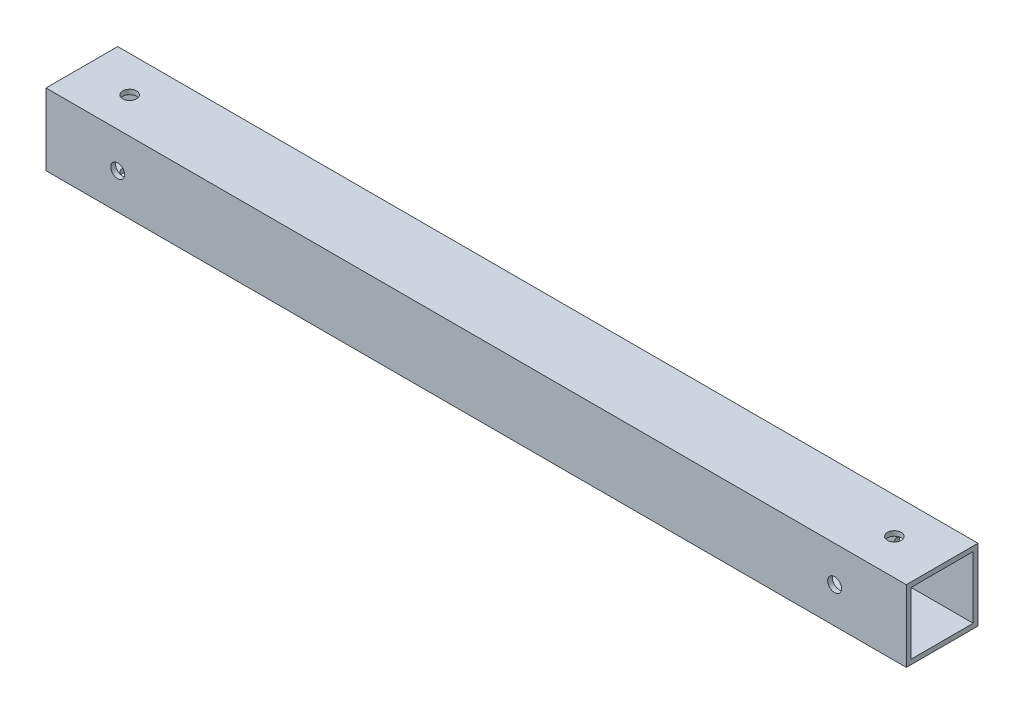
ISO-10303-21;
HEADER;
FILE_DESCRIPTION(('STEP AP214'),'2;1');
FILE_NAME('part.step','',(''),(''),'','','');
FILE_SCHEMA(('AUTOMOTIVE_DESIGN { 1 0 10303 214 1 1 1 1 }'));
ENDSEC;
DATA;
#1=APPLICATION_CONTEXT('core data for automotive mechanical design processes');
#2=APPLICATION_PROTOCOL_DEFINITION('international standard','automotive_design',2000,#1);
#3=PRODUCT_CONTEXT('',#1,'mechanical');
#4=PRODUCT('Part','Part','',(#3));
#5=PRODUCT_RELATED_PRODUCT_CATEGORY('part','',(#4));
#6=PRODUCT_DEFINITION_FORMATION('','',#4);
#7=PRODUCT_DEFINITION_CONTEXT('part definition',#1,'design');
#8=PRODUCT_DEFINITION('design','',#6,#7);
#9=PRODUCT_DEFINITION_SHAPE('','',#8);
#10=(LENGTH_UNIT() NAMED_UNIT(*) SI_UNIT(.MILLI.,.METRE.));
#11=(NAMED_UNIT(*) PLANE_ANGLE_UNIT() SI_UNIT($,.RADIAN.));
#12=(NAMED_UNIT(*) SI_UNIT($,.STERADIAN.) SOLID_ANGLE_UNIT());
#13=UNCERTAINTY_MEASURE_WITH_UNIT(LENGTH_MEASURE(1.E-05),#10,'distance_accuracy_value','');
#14=(GEOMETRIC_REPRESENTATION_CONTEXT(3) GLOBAL_UNCERTAINTY_ASSIGNED_CONTEXT((#13)) GLOBAL_UNIT_ASSIGNED_CONTEXT((#10,
#11,#12)) REPRESENTATION_CONTEXT('',''));
#15=CARTESIAN_POINT('',(0.,0.,0.));
#16=DIRECTION('',(0.,0.,1.));
#17=DIRECTION('',(1.,0.,0.));
#18=AXIS2_PLACEMENT_3D('',#15,#16,#17);
#19=CARTESIAN_POINT('',(180.,0.,0.));
#20=DIRECTION('',(-1.,0.,0.));
#21=DIRECTION('',(0.,0.,1.));
#22=AXIS2_PLACEMENT_3D('',#19,#20,#21);
#23=PLANE('',#22);
#24=DIRECTION('',(0.,1.,0.));
#25=VECTOR('',#24,1.);
#26=CARTESIAN_POINT('',(180.,-7.5,-7.5));
#27=LINE('',#26,#25);
#28=CARTESIAN_POINT('',(180.,-7.5,-7.5));
#29=VERTEX_POINT('',#28);
#30=CARTESIAN_POINT('',(180.,7.5,-7.5));
#31=VERTEX_POINT('',#30);
#32=EDGE_CURVE('E146',#29,#31,#27,.T.);
#33=ORIENTED_EDGE('',*,*,#32,.T.);
#34=DIRECTION('',(0.,0.,1.));
#35=VECTOR('',#34,1.);
#36=CARTESIAN_POINT('',(180.,7.5,7.5));
#37=LINE('',#36,#35);
#38=CARTESIAN_POINT('',(180.,7.5,7.5));
#39=VERTEX_POINT('',#38);
#40=EDGE_CURVE('E149',#31,#39,#37,.T.);
#41=ORIENTED_EDGE('',*,*,#40,.T.);
#42=DIRECTION('',(0.,-1.,0.));
#43=VECTOR('',#42,1.);
#44=CARTESIAN_POINT('',(180.,-7.5,7.5));
#45=LINE('',#44,#43);
#46=CARTESIAN_POINT('',(180.,-7.5,7.5));
#47=VERTEX_POINT('',#46);
#48=EDGE_CURVE('E152',#39,#47,#45,.T.);
#49=ORIENTED_EDGE('',*,*,#48,.T.);
#50=DIRECTION('',(0.,0.,-1.));
#51=VECTOR('',#50,1.);
#52=CARTESIAN_POINT('',(180.,-7.5,7.5));
#53=LINE('',#52,#51);
#54=EDGE_CURVE('E154',#47,#29,#53,.T.);
#55=ORIENTED_EDGE('',*,*,#54,.T.);
#56=EDGE_LOOP('',(#33,#41,#49,#55));
#57=FACE_BOUND('',#56,.T.);
#58=DIRECTION('',(0.,0.,-1.));
#59=VECTOR('',#58,1.);
#60=CARTESIAN_POINT('',(180.,-6.5,6.5));
#61=LINE('',#60,#59);
#62=CARTESIAN_POINT('',(180.,-6.5,6.5));
#63=VERTEX_POINT('',#62);
#64=CARTESIAN_POINT('',(180.,-6.5,-6.5));
#65=VERTEX_POINT('',#64);
#66=EDGE_CURVE('E108',#63,#65,#61,.T.);
#67=ORIENTED_EDGE('',*,*,#66,.F.);
#68=DIRECTION('',(0.,-1.,0.));
#69=VECTOR('',#68,1.);
#70=CARTESIAN_POINT('',(180.,-6.5,6.5));
#71=LINE('',#70,#69);
#72=CARTESIAN_POINT('',(180.,6.5,6.5));
#73=VERTEX_POINT('',#72);
#74=EDGE_CURVE('E130',#73,#63,#71,.T.);
#75=ORIENTED_EDGE('',*,*,#74,.F.);
#76=DIRECTION('',(0.,0.,1.));
#77=VECTOR('',#76,1.);
#78=CARTESIAN_POINT('',(180.,6.5,6.5));
#79=LINE('',#78,#77);
#80=CARTESIAN_POINT('',(180.,6.5,-6.5));
#81=VERTEX_POINT('',#80);
#82=EDGE_CURVE('E128',#81,#73,#79,.T.);
#83=ORIENTED_EDGE('',*,*,#82,.F.);
#84=DIRECTION('',(0.,1.,0.));
#85=VECTOR('',#84,1.);
#86=CARTESIAN_POINT('',(180.,-6.5,-6.5));
#87=LINE('',#86,#85);
#88=EDGE_CURVE('E116',#65,#81,#87,.T.);
#89=ORIENTED_EDGE('',*,*,#88,.F.);
#90=EDGE_LOOP('',(#67,#75,#83,#89));
#91=FACE_BOUND('',#90,.T.);
#92=ADVANCED_FACE('F41',(#57,#91),#23,.F.);
#93=CARTESIAN_POINT('',(0.,0.,0.));
#94=DIRECTION('',(-1.,0.,0.));
#95=DIRECTION('',(0.,0.,1.));
#96=AXIS2_PLACEMENT_3D('',#93,#94,#95);
#97=PLANE('',#96);
#98=DIRECTION('',(0.,1.,0.));
#99=VECTOR('',#98,1.);
#100=CARTESIAN_POINT('',(0.,-7.5,-7.5));
#101=LINE('',#100,#99);
#102=CARTESIAN_POINT('',(0.,-7.5,-7.5));
#103=VERTEX_POINT('',#102);
#104=CARTESIAN_POINT('',(0.,7.5,-7.5));
#105=VERTEX_POINT('',#104);
#106=EDGE_CURVE('E124',#103,#105,#101,.T.);
#107=ORIENTED_EDGE('',*,*,#106,.F.);
#108=DIRECTION('',(0.,0.,-1.));
#109=VECTOR('',#108,1.);
#110=CARTESIAN_POINT('',(0.,-7.5,7.5));
#111=LINE('',#110,#109);
#112=CARTESIAN_POINT('',(0.,-7.5,7.5));
#113=VERTEX_POINT('',#112);
#114=EDGE_CURVE('E150',#113,#103,#111,.T.);
#115=ORIENTED_EDGE('',*,*,#114,.F.);
#116=DIRECTION('',(0.,-1.,0.));
#117=VECTOR('',#116,1.);
#118=CARTESIAN_POINT('',(0.,-7.5,7.5));
#119=LINE('',#118,#117);
#120=CARTESIAN_POINT('',(0.,7.5,7.5));
#121=VERTEX_POINT('',#120);
#122=EDGE_CURVE('E161',#121,#113,#119,.T.);
#123=ORIENTED_EDGE('',*,*,#122,.F.);
#124=DIRECTION('',(0.,0.,1.));
#125=VECTOR('',#124,1.);
#126=CARTESIAN_POINT('',(0.,7.5,7.5));
#127=LINE('',#126,#125);
#128=EDGE_CURVE('E159',#105,#121,#127,.T.);
#129=ORIENTED_EDGE('',*,*,#128,.F.);
#130=EDGE_LOOP('',(#107,#115,#123,#129));
#131=FACE_BOUND('',#130,.T.);
#132=DIRECTION('',(0.,-1.,0.));
#133=VECTOR('',#132,1.);
#134=CARTESIAN_POINT('',(0.,-6.5,6.5));
#135=LINE('',#134,#133);
#136=CARTESIAN_POINT('',(0.,6.5,6.5));
#137=VERTEX_POINT('',#136);
#138=CARTESIAN_POINT('',(0.,-6.5,6.5));
#139=VERTEX_POINT('',#138);
#140=EDGE_CURVE('E117',#137,#139,#135,.T.);
#141=ORIENTED_EDGE('',*,*,#140,.T.);
#142=DIRECTION('',(0.,0.,-1.));
#143=VECTOR('',#142,1.);
#144=CARTESIAN_POINT('',(0.,-6.5,6.5));
#145=LINE('',#144,#143);
#146=CARTESIAN_POINT('',(0.,-6.5,-6.5));
#147=VERTEX_POINT('',#146);
#148=EDGE_CURVE('E66',#139,#147,#145,.T.);
#149=ORIENTED_EDGE('',*,*,#148,.T.);
#150=DIRECTION('',(0.,1.,0.));
#151=VECTOR('',#150,1.);
#152=CARTESIAN_POINT('',(0.,-6.5,-6.5));
#153=LINE('',#152,#151);
#154=CARTESIAN_POINT('',(0.,6.5,-6.5));
#155=VERTEX_POINT('',#154);
#156=EDGE_CURVE('E123',#147,#155,#153,.T.);
#157=ORIENTED_EDGE('',*,*,#156,.T.);
#158=DIRECTION('',(0.,0.,1.));
#159=VECTOR('',#158,1.);
#160=CARTESIAN_POINT('',(0.,6.5,6.5));
#161=LINE('',#160,#159);
#162=EDGE_CURVE('E138',#155,#137,#161,.T.);
#163=ORIENTED_EDGE('',*,*,#162,.T.);
#164=EDGE_LOOP('',(#141,#149,#157,#163));
#165=FACE_BOUND('',#164,.T.);
#166=ADVANCED_FACE('F250',(#131,#165),#97,.T.);
#167=CARTESIAN_POINT('',(180.,-7.5,-7.5));
#168=DIRECTION('',(0.,0.,1.));
#169=DIRECTION('',(1.,0.,0.));
#170=AXIS2_PLACEMENT_3D('',#167,#168,#169);
#171=PLANE('',#170);
#172=CARTESIAN_POINT('',(15.,0.,-7.5));
#173=DIRECTION('',(0.,0.,1.));
#174=DIRECTION('',(1.,0.,0.));
#175=AXIS2_PLACEMENT_3D('',#172,#173,#174);
#176=CIRCLE('',#175,1.45);
#177=CARTESIAN_POINT('',(16.45,0.,-7.5));
#178=VERTEX_POINT('',#177);
#179=EDGE_CURVE('E181',#178,#178,#176,.T.);
#180=ORIENTED_EDGE('',*,*,#179,.T.);
#181=EDGE_LOOP('',(#180));
#182=FACE_BOUND('',#181,.T.);
#183=CARTESIAN_POINT('',(165.,0.,-7.5));
#184=DIRECTION('',(0.,0.,1.));
#185=DIRECTION('',(1.,0.,0.));
#186=AXIS2_PLACEMENT_3D('',#183,#184,#185);
#187=CIRCLE('',#186,1.45);
#188=CARTESIAN_POINT('',(166.45,0.,-7.5));
#189=VERTEX_POINT('',#188);
#190=EDGE_CURVE('E197',#189,#189,#187,.T.);
#191=ORIENTED_EDGE('',*,*,#190,.T.);
#192=EDGE_LOOP('',(#191));
#193=FACE_BOUND('',#192,.T.);
#194=ORIENTED_EDGE('',*,*,#106,.T.);
#195=DIRECTION('',(-1.,0.,0.));
#196=VECTOR('',#195,1.);
#197=CARTESIAN_POINT('',(180.,7.5,-7.5));
#198=LINE('',#197,#196);
#199=EDGE_CURVE('E11',#31,#105,#198,.T.);
#200=ORIENTED_EDGE('',*,*,#199,.F.);
#201=ORIENTED_EDGE('',*,*,#32,.F.);
#202=DIRECTION('',(-1.,0.,0.));
#203=VECTOR('',#202,1.);
#204=CARTESIAN_POINT('',(180.,-7.5,-7.5));
#205=LINE('',#204,#203);
#206=EDGE_CURVE('E156',#29,#103,#205,.T.);
#207=ORIENTED_EDGE('',*,*,#206,.T.);
#208=EDGE_LOOP('',(#194,#200,#201,#207));
#209=FACE_BOUND('',#208,.T.);
#210=ADVANCED_FACE('F43',(#182,#193,#209),#171,.F.);
#211=CARTESIAN_POINT('',(180.,7.5,7.5));
#212=DIRECTION('',(0.,-1.,0.));
#213=DIRECTION('',(0.,0.,-1.));
#214=AXIS2_PLACEMENT_3D('',#211,#212,#213);
#215=PLANE('',#214);
#216=CARTESIAN_POINT('',(9.99999999999999,7.5,0.));
#217=DIRECTION('',(0.,1.,0.));
#218=DIRECTION('',(0.,0.,1.));
#219=AXIS2_PLACEMENT_3D('',#216,#217,#218);
#220=CIRCLE('',#219,1.45);
#221=CARTESIAN_POINT('',(9.99999999999999,7.5,1.45000000000001));
#222=VERTEX_POINT('',#221);
#223=EDGE_CURVE('E206',#222,#222,#220,.T.);
#224=ORIENTED_EDGE('',*,*,#223,.F.);
#225=EDGE_LOOP('',(#224));
#226=FACE_BOUND('',#225,.T.);
#227=CARTESIAN_POINT('',(170.,7.5,0.));
#228=DIRECTION('',(0.,1.,0.));
#229=DIRECTION('',(0.,0.,1.));
#230=AXIS2_PLACEMENT_3D('',#227,#228,#229);
#231=CIRCLE('',#230,1.45);
#232=CARTESIAN_POINT('',(170.,7.5,1.45000000000009));
#233=VERTEX_POINT('',#232);
#234=EDGE_CURVE('E209',#233,#233,#231,.T.);
#235=ORIENTED_EDGE('',*,*,#234,.F.);
#236=EDGE_LOOP('',(#235));
#237=FACE_BOUND('',#236,.T.);
#238=ORIENTED_EDGE('',*,*,#128,.T.);
#239=DIRECTION('',(-1.,0.,0.));
#240=VECTOR('',#239,1.);
#241=CARTESIAN_POINT('',(180.,7.5,7.5));
#242=LINE('',#241,#240);
#243=EDGE_CURVE('E50',#39,#121,#242,.T.);
#244=ORIENTED_EDGE('',*,*,#243,.F.);
#245=ORIENTED_EDGE('',*,*,#40,.F.);
#246=ORIENTED_EDGE('',*,*,#199,.T.);
#247=EDGE_LOOP('',(#238,#244,#245,#246));
#248=FACE_BOUND('',#247,.T.);
#249=ADVANCED_FACE('F254',(#226,#237,#248),#215,.F.);
#250=CARTESIAN_POINT('',(180.,-7.5,7.5));
#251=DIRECTION('',(0.,0.,-1.));
#252=DIRECTION('',(-1.,0.,0.));
#253=AXIS2_PLACEMENT_3D('',#250,#251,#252);
#254=PLANE('',#253);
#255=CARTESIAN_POINT('',(15.,0.,7.5));
#256=DIRECTION('',(0.,0.,1.));
#257=DIRECTION('',(1.,0.,0.));
#258=AXIS2_PLACEMENT_3D('',#255,#256,#257);
#259=CIRCLE('',#258,1.45);
#260=CARTESIAN_POINT('',(16.45,0.,7.5));
#261=VERTEX_POINT('',#260);
#262=EDGE_CURVE('E187',#261,#261,#259,.T.);
#263=ORIENTED_EDGE('',*,*,#262,.F.);
#264=EDGE_LOOP('',(#263));
#265=FACE_BOUND('',#264,.T.);
#266=CARTESIAN_POINT('',(165.,0.,7.5));
#267=DIRECTION('',(0.,0.,1.));
#268=DIRECTION('',(1.,0.,0.));
#269=AXIS2_PLACEMENT_3D('',#266,#267,#268);
#270=CIRCLE('',#269,1.45);
#271=CARTESIAN_POINT('',(166.45,0.,7.5));
#272=VERTEX_POINT('',#271);
#273=EDGE_CURVE('E192',#272,#272,#270,.T.);
#274=ORIENTED_EDGE('',*,*,#273,.F.);
#275=EDGE_LOOP('',(#274));
#276=FACE_BOUND('',#275,.T.);
#277=ORIENTED_EDGE('',*,*,#122,.T.);
#278=DIRECTION('',(-1.,0.,0.));
#279=VECTOR('',#278,1.);
#280=CARTESIAN_POINT('',(180.,-7.5,7.5));
#281=LINE('',#280,#279);
#282=EDGE_CURVE('E166',#47,#113,#281,.T.);
#283=ORIENTED_EDGE('',*,*,#282,.F.);
#284=ORIENTED_EDGE('',*,*,#48,.F.);
#285=ORIENTED_EDGE('',*,*,#243,.T.);
#286=EDGE_LOOP('',(#277,#283,#284,#285));
#287=FACE_BOUND('',#286,.T.);
#288=ADVANCED_FACE('F237',(#265,#276,#287),#254,.F.);
#289=CARTESIAN_POINT('',(180.,-7.5,7.5));
#290=DIRECTION('',(0.,1.,0.));
#291=DIRECTION('',(0.,0.,1.));
#292=AXIS2_PLACEMENT_3D('',#289,#290,#291);
#293=PLANE('',#292);
#294=CARTESIAN_POINT('',(9.99999999999999,-7.5,0.));
#295=DIRECTION('',(0.,1.,0.));
#296=DIRECTION('',(0.,0.,1.));
#297=AXIS2_PLACEMENT_3D('',#294,#295,#296);
#298=CIRCLE('',#297,1.45);
#299=CARTESIAN_POINT('',(9.99999999999999,-7.5,1.45000000000001));
#300=VERTEX_POINT('',#299);
#301=EDGE_CURVE('E175',#300,#300,#298,.T.);
#302=ORIENTED_EDGE('',*,*,#301,.T.);
#303=EDGE_LOOP('',(#302));
#304=FACE_BOUND('',#303,.T.);
#305=CARTESIAN_POINT('',(170.,-7.5,0.));
#306=DIRECTION('',(0.,1.,0.));
#307=DIRECTION('',(0.,0.,1.));
#308=AXIS2_PLACEMENT_3D('',#305,#306,#307);
#309=CIRCLE('',#308,1.45);
#310=CARTESIAN_POINT('',(170.,-7.5,1.45000000000009));
#311=VERTEX_POINT('',#310);
#312=EDGE_CURVE('E203',#311,#311,#309,.T.);
#313=ORIENTED_EDGE('',*,*,#312,.T.);
#314=EDGE_LOOP('',(#313));
#315=FACE_BOUND('',#314,.T.);
#316=ORIENTED_EDGE('',*,*,#114,.T.);
#317=ORIENTED_EDGE('',*,*,#206,.F.);
#318=ORIENTED_EDGE('',*,*,#54,.F.);
#319=ORIENTED_EDGE('',*,*,#282,.T.);
#320=EDGE_LOOP('',(#316,#317,#318,#319));
#321=FACE_BOUND('',#320,.T.);
#322=ADVANCED_FACE('F223',(#304,#315,#321),#293,.F.);
#323=CARTESIAN_POINT('',(180.,-6.5,6.5));
#324=DIRECTION('',(0.,1.,0.));
#325=DIRECTION('',(0.,0.,1.));
#326=AXIS2_PLACEMENT_3D('',#323,#324,#325);
#327=PLANE('',#326);
#328=CARTESIAN_POINT('',(9.99999999999999,-6.5,0.));
#329=DIRECTION('',(0.,1.,0.));
#330=DIRECTION('',(0.,0.,1.));
#331=AXIS2_PLACEMENT_3D('',#328,#329,#330);
#332=CIRCLE('',#331,1.45);
#333=CARTESIAN_POINT('',(9.99999999999999,-6.5,1.45000000000001));
#334=VERTEX_POINT('',#333);
#335=EDGE_CURVE('E136',#334,#334,#332,.T.);
#336=ORIENTED_EDGE('',*,*,#335,.F.);
#337=EDGE_LOOP('',(#336));
#338=FACE_BOUND('',#337,.T.);
#339=CARTESIAN_POINT('',(170.,-6.5,0.));
#340=DIRECTION('',(0.,1.,0.));
#341=DIRECTION('',(0.,0.,1.));
#342=AXIS2_PLACEMENT_3D('',#339,#340,#341);
#343=CIRCLE('',#342,1.45);
#344=CARTESIAN_POINT('',(170.,-6.5,1.45000000000009));
#345=VERTEX_POINT('',#344);
#346=EDGE_CURVE('E174',#345,#345,#343,.T.);
#347=ORIENTED_EDGE('',*,*,#346,.F.);
#348=EDGE_LOOP('',(#347));
#349=FACE_BOUND('',#348,.T.);
#350=ORIENTED_EDGE('',*,*,#148,.F.);
#351=DIRECTION('',(-1.,0.,0.));
#352=VECTOR('',#351,1.);
#353=CARTESIAN_POINT('',(180.,-6.5,6.5));
#354=LINE('',#353,#352);
#355=EDGE_CURVE('E112',#63,#139,#354,.T.);
#356=ORIENTED_EDGE('',*,*,#355,.F.);
#357=ORIENTED_EDGE('',*,*,#66,.T.);
#358=DIRECTION('',(-1.,0.,0.));
#359=VECTOR('',#358,1.);
#360=CARTESIAN_POINT('',(180.,-6.5,-6.5));
#361=LINE('',#360,#359);
#362=EDGE_CURVE('E111',#65,#147,#361,.T.);
#363=ORIENTED_EDGE('',*,*,#362,.T.);
#364=EDGE_LOOP('',(#350,#356,#357,#363));
#365=FACE_BOUND('',#364,.T.);
#366=ADVANCED_FACE('F110',(#338,#349,#365),#327,.T.);
#367=CARTESIAN_POINT('',(180.,-6.5,-6.5));
#368=DIRECTION('',(0.,0.,1.));
#369=DIRECTION('',(0.,-1.,0.));
#370=AXIS2_PLACEMENT_3D('',#367,#368,#369);
#371=PLANE('',#370);
#372=CARTESIAN_POINT('',(15.,0.,-6.5));
#373=DIRECTION('',(0.,0.,1.));
#374=DIRECTION('',(0.,-1.,0.));
#375=AXIS2_PLACEMENT_3D('',#372,#373,#374);
#376=CIRCLE('',#375,1.45);
#377=CARTESIAN_POINT('',(15.,-1.45000000000001,-6.5));
#378=VERTEX_POINT('',#377);
#379=EDGE_CURVE('E200',#378,#378,#376,.T.);
#380=ORIENTED_EDGE('',*,*,#379,.F.);
#381=EDGE_LOOP('',(#380));
#382=FACE_BOUND('',#381,.T.);
#383=CARTESIAN_POINT('',(165.,0.,-6.5));
#384=DIRECTION('',(0.,0.,1.));
#385=DIRECTION('',(0.,-1.,0.));
#386=AXIS2_PLACEMENT_3D('',#383,#384,#385);
#387=CIRCLE('',#386,1.45);
#388=CARTESIAN_POINT('',(165.,-1.45000000000001,-6.5));
#389=VERTEX_POINT('',#388);
#390=EDGE_CURVE('E180',#389,#389,#387,.T.);
#391=ORIENTED_EDGE('',*,*,#390,.F.);
#392=EDGE_LOOP('',(#391));
#393=FACE_BOUND('',#392,.T.);
#394=ORIENTED_EDGE('',*,*,#156,.F.);
#395=ORIENTED_EDGE('',*,*,#362,.F.);
#396=ORIENTED_EDGE('',*,*,#88,.T.);
#397=DIRECTION('',(-1.,0.,0.));
#398=VECTOR('',#397,1.);
#399=CARTESIAN_POINT('',(180.,6.5,-6.5));
#400=LINE('',#399,#398);
#401=EDGE_CURVE('E125',#81,#155,#400,.T.);
#402=ORIENTED_EDGE('',*,*,#401,.T.);
#403=EDGE_LOOP('',(#394,#395,#396,#402));
#404=FACE_BOUND('',#403,.T.);
#405=ADVANCED_FACE('F120',(#382,#393,#404),#371,.T.);
#406=CARTESIAN_POINT('',(180.,6.5,6.5));
#407=DIRECTION('',(0.,-1.,0.));
#408=DIRECTION('',(0.,0.,-1.));
#409=AXIS2_PLACEMENT_3D('',#406,#407,#408);
#410=PLANE('',#409);
#411=CARTESIAN_POINT('',(9.99999999999999,6.5,0.));
#412=DIRECTION('',(0.,-1.,0.));
#413=DIRECTION('',(0.,0.,-1.));
#414=AXIS2_PLACEMENT_3D('',#411,#412,#413);
#415=CIRCLE('',#414,1.45);
#416=CARTESIAN_POINT('',(9.99999999999999,6.5,-1.44999999999999));
#417=VERTEX_POINT('',#416);
#418=EDGE_CURVE('E176',#417,#417,#415,.T.);
#419=ORIENTED_EDGE('',*,*,#418,.F.);
#420=EDGE_LOOP('',(#419));
#421=FACE_BOUND('',#420,.T.);
#422=CARTESIAN_POINT('',(170.,6.5,0.));
#423=DIRECTION('',(0.,-1.,0.));
#424=DIRECTION('',(0.,0.,-1.));
#425=AXIS2_PLACEMENT_3D('',#422,#423,#424);
#426=CIRCLE('',#425,1.45);
#427=CARTESIAN_POINT('',(170.,6.5,-1.44999999999992));
#428=VERTEX_POINT('',#427);
#429=EDGE_CURVE('E171',#428,#428,#426,.T.);
#430=ORIENTED_EDGE('',*,*,#429,.F.);
#431=EDGE_LOOP('',(#430));
#432=FACE_BOUND('',#431,.T.);
#433=ORIENTED_EDGE('',*,*,#162,.F.);
#434=ORIENTED_EDGE('',*,*,#401,.F.);
#435=ORIENTED_EDGE('',*,*,#82,.T.);
#436=DIRECTION('',(-1.,0.,0.));
#437=VECTOR('',#436,1.);
#438=CARTESIAN_POINT('',(180.,6.5,6.5));
#439=LINE('',#438,#437);
#440=EDGE_CURVE('E58',#73,#137,#439,.T.);
#441=ORIENTED_EDGE('',*,*,#440,.T.);
#442=EDGE_LOOP('',(#433,#434,#435,#441));
#443=FACE_BOUND('',#442,.T.);
#444=ADVANCED_FACE('F277',(#421,#432,#443),#410,.T.);
#445=CARTESIAN_POINT('',(180.,-6.5,6.5));
#446=DIRECTION('',(0.,0.,-1.));
#447=DIRECTION('',(-1.,0.,0.));
#448=AXIS2_PLACEMENT_3D('',#445,#446,#447);
#449=PLANE('',#448);
#450=CARTESIAN_POINT('',(15.,0.,6.5));
#451=DIRECTION('',(0.,0.,-1.));
#452=DIRECTION('',(-1.,0.,0.));
#453=AXIS2_PLACEMENT_3D('',#450,#451,#452);
#454=CIRCLE('',#453,1.45);
#455=CARTESIAN_POINT('',(13.55,0.,6.5));
#456=VERTEX_POINT('',#455);
#457=EDGE_CURVE('E45',#456,#456,#454,.T.);
#458=ORIENTED_EDGE('',*,*,#457,.F.);
#459=EDGE_LOOP('',(#458));
#460=FACE_BOUND('',#459,.T.);
#461=CARTESIAN_POINT('',(165.,0.,6.5));
#462=DIRECTION('',(0.,0.,-1.));
#463=DIRECTION('',(-1.,0.,0.));
#464=AXIS2_PLACEMENT_3D('',#461,#462,#463);
#465=CIRCLE('',#464,1.45);
#466=CARTESIAN_POINT('',(163.55,0.,6.5));
#467=VERTEX_POINT('',#466);
#468=EDGE_CURVE('E178',#467,#467,#465,.T.);
#469=ORIENTED_EDGE('',*,*,#468,.F.);
#470=EDGE_LOOP('',(#469));
#471=FACE_BOUND('',#470,.T.);
#472=ORIENTED_EDGE('',*,*,#140,.F.);
#473=ORIENTED_EDGE('',*,*,#440,.F.);
#474=ORIENTED_EDGE('',*,*,#74,.T.);
#475=ORIENTED_EDGE('',*,*,#355,.T.);
#476=EDGE_LOOP('',(#472,#473,#474,#475));
#477=FACE_BOUND('',#476,.T.);
#478=ADVANCED_FACE('F281',(#460,#471,#477),#449,.T.);
#479=CARTESIAN_POINT('',(170.,-7.5,0.));
#480=DIRECTION('',(0.,1.,0.));
#481=DIRECTION('',(0.,0.,1.));
#482=AXIS2_PLACEMENT_3D('',#479,#480,#481);
#483=CYLINDRICAL_SURFACE('',#482,1.45);
#484=ORIENTED_EDGE('',*,*,#429,.T.);
#485=EDGE_LOOP('',(#484));
#486=FACE_BOUND('',#485,.T.);
#487=ORIENTED_EDGE('',*,*,#234,.T.);
#488=EDGE_LOOP('',(#487));
#489=FACE_BOUND('',#488,.T.);
#490=ADVANCED_FACE('F232',(#486,#489),#483,.F.);
#491=CARTESIAN_POINT('',(9.99999999999999,-7.5,0.));
#492=DIRECTION('',(0.,1.,0.));
#493=DIRECTION('',(0.,0.,1.));
#494=AXIS2_PLACEMENT_3D('',#491,#492,#493);
#495=CYLINDRICAL_SURFACE('',#494,1.45);
#496=ORIENTED_EDGE('',*,*,#418,.T.);
#497=EDGE_LOOP('',(#496));
#498=FACE_BOUND('',#497,.T.);
#499=ORIENTED_EDGE('',*,*,#223,.T.);
#500=EDGE_LOOP('',(#499));
#501=FACE_BOUND('',#500,.T.);
#502=ADVANCED_FACE('F230',(#498,#501),#495,.F.);
#503=ORIENTED_EDGE('',*,*,#346,.T.);
#504=EDGE_LOOP('',(#503));
#505=FACE_BOUND('',#504,.T.);
#506=ORIENTED_EDGE('',*,*,#312,.F.);
#507=EDGE_LOOP('',(#506));
#508=FACE_BOUND('',#507,.T.);
#509=ADVANCED_FACE('F227',(#505,#508),#483,.F.);
#510=ORIENTED_EDGE('',*,*,#335,.T.);
#511=EDGE_LOOP('',(#510));
#512=FACE_BOUND('',#511,.T.);
#513=ORIENTED_EDGE('',*,*,#301,.F.);
#514=EDGE_LOOP('',(#513));
#515=FACE_BOUND('',#514,.T.);
#516=ADVANCED_FACE('F218',(#512,#515),#495,.F.);
#517=CARTESIAN_POINT('',(165.,0.,-7.5));
#518=DIRECTION('',(0.,0.,1.));
#519=DIRECTION('',(1.,0.,0.));
#520=AXIS2_PLACEMENT_3D('',#517,#518,#519);
#521=CYLINDRICAL_SURFACE('',#520,1.45);
#522=ORIENTED_EDGE('',*,*,#468,.T.);
#523=EDGE_LOOP('',(#522));
#524=FACE_BOUND('',#523,.T.);
#525=ORIENTED_EDGE('',*,*,#273,.T.);
#526=EDGE_LOOP('',(#525));
#527=FACE_BOUND('',#526,.T.);
#528=ADVANCED_FACE('F291',(#524,#527),#521,.F.);
#529=CARTESIAN_POINT('',(15.,0.,-7.5));
#530=DIRECTION('',(0.,0.,1.));
#531=DIRECTION('',(1.,0.,0.));
#532=AXIS2_PLACEMENT_3D('',#529,#530,#531);
#533=CYLINDRICAL_SURFACE('',#532,1.45);
#534=ORIENTED_EDGE('',*,*,#457,.T.);
#535=EDGE_LOOP('',(#534));
#536=FACE_BOUND('',#535,.T.);
#537=ORIENTED_EDGE('',*,*,#262,.T.);
#538=EDGE_LOOP('',(#537));
#539=FACE_BOUND('',#538,.T.);
#540=ADVANCED_FACE('F294',(#536,#539),#533,.F.);
#541=ORIENTED_EDGE('',*,*,#390,.T.);
#542=EDGE_LOOP('',(#541));
#543=FACE_BOUND('',#542,.T.);
#544=ORIENTED_EDGE('',*,*,#190,.F.);
#545=EDGE_LOOP('',(#544));
#546=FACE_BOUND('',#545,.T.);
#547=ADVANCED_FACE('F295',(#543,#546),#521,.F.);
#548=ORIENTED_EDGE('',*,*,#379,.T.);
#549=EDGE_LOOP('',(#548));
#550=FACE_BOUND('',#549,.T.);
#551=ORIENTED_EDGE('',*,*,#179,.F.);
#552=EDGE_LOOP('',(#551));
#553=FACE_BOUND('',#552,.T.);
#554=ADVANCED_FACE('F298',(#550,#553),#533,.F.);
#555=CLOSED_SHELL('',(#92,#166,#210,#249,#288,#322,#366,#405,#444,#478,#490,#502,#509,#516,#528,
#540,#547,#554));
#556=MANIFOLD_SOLID_BREP('B2',#555);
#557=ADVANCED_BREP_SHAPE_REPRESENTATION('',(#18,#556),#14);
#558=SHAPE_DEFINITION_REPRESENTATION(#9,#557);
ENDSEC;
END-ISO-10303-21;
